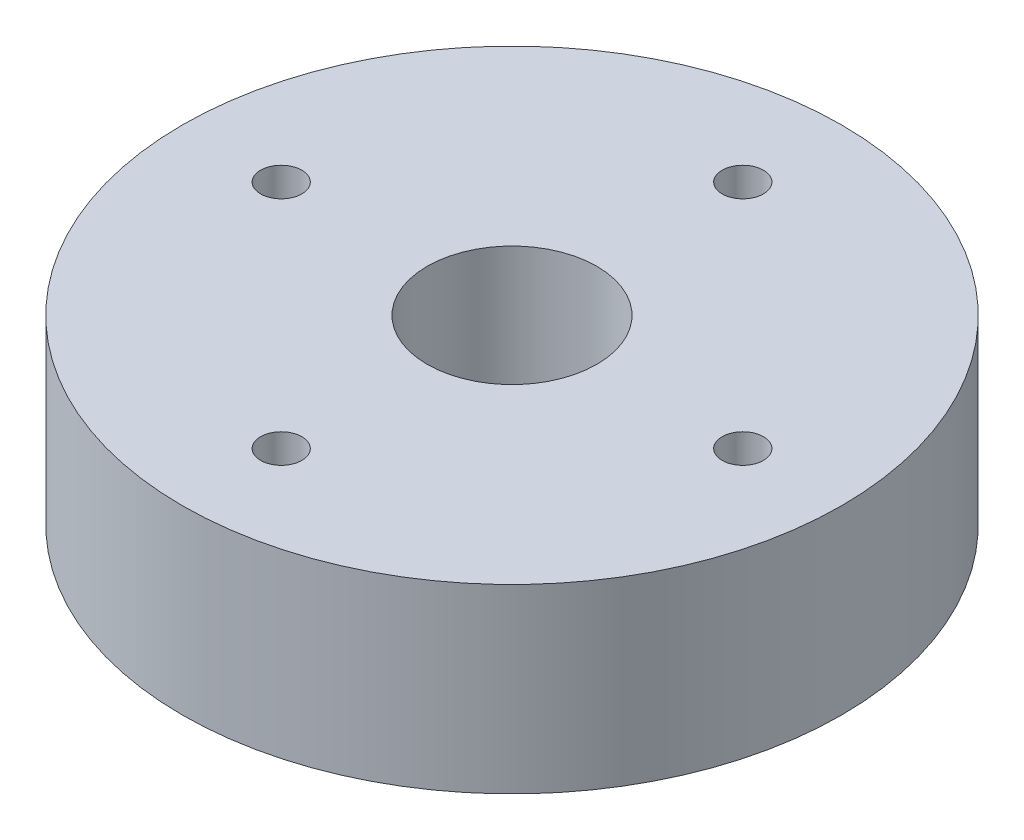
ISO-10303-21;
HEADER;
FILE_DESCRIPTION(('STEP AP214'),'2;1');
FILE_NAME('part.step','',(''),(''),'','','');
FILE_SCHEMA(('AUTOMOTIVE_DESIGN { 1 0 10303 214 1 1 1 1 }'));
ENDSEC;
DATA;
#1=APPLICATION_CONTEXT('core data for automotive mechanical design processes');
#2=APPLICATION_PROTOCOL_DEFINITION('international standard','automotive_design',2000,#1);
#3=PRODUCT_CONTEXT('',#1,'mechanical');
#4=PRODUCT('Part','Part','',(#3));
#5=PRODUCT_RELATED_PRODUCT_CATEGORY('part','',(#4));
#6=PRODUCT_DEFINITION_FORMATION('','',#4);
#7=PRODUCT_DEFINITION_CONTEXT('part definition',#1,'design');
#8=PRODUCT_DEFINITION('design','',#6,#7);
#9=PRODUCT_DEFINITION_SHAPE('','',#8);
#10=(LENGTH_UNIT() NAMED_UNIT(*) SI_UNIT(.MILLI.,.METRE.));
#11=(NAMED_UNIT(*) PLANE_ANGLE_UNIT() SI_UNIT($,.RADIAN.));
#12=(NAMED_UNIT(*) SI_UNIT($,.STERADIAN.) SOLID_ANGLE_UNIT());
#13=UNCERTAINTY_MEASURE_WITH_UNIT(LENGTH_MEASURE(1.E-05),#10,'distance_accuracy_value','');
#14=(GEOMETRIC_REPRESENTATION_CONTEXT(3) GLOBAL_UNCERTAINTY_ASSIGNED_CONTEXT((#13)) GLOBAL_UNIT_ASSIGNED_CONTEXT((#10,
#11,#12)) REPRESENTATION_CONTEXT('',''));
#15=CARTESIAN_POINT('',(0.,0.,0.));
#16=DIRECTION('',(0.,0.,1.));
#17=DIRECTION('',(1.,0.,0.));
#18=AXIS2_PLACEMENT_3D('',#15,#16,#17);
#19=CARTESIAN_POINT('',(0.,6.,0.));
#20=DIRECTION('',(0.,1.,0.));
#21=DIRECTION('',(0.,0.,1.));
#22=AXIS2_PLACEMENT_3D('',#19,#20,#21);
#23=PLANE('',#22);
#24=CARTESIAN_POINT('',(0.,6.,-14.));
#25=DIRECTION('',(0.,1.,0.));
#26=DIRECTION('',(0.,0.,1.));
#27=AXIS2_PLACEMENT_3D('',#24,#25,#26);
#28=CIRCLE('',#27,1.25);
#29=CARTESIAN_POINT('',(0.,6.,-12.75));
#30=VERTEX_POINT('',#29);
#31=EDGE_CURVE('E79',#30,#30,#28,.T.);
#32=ORIENTED_EDGE('',*,*,#31,.F.);
#33=EDGE_LOOP('',(#32));
#34=FACE_BOUND('',#33,.T.);
#35=CARTESIAN_POINT('',(0.,6.,14.));
#36=DIRECTION('',(0.,1.,0.));
#37=DIRECTION('',(0.,0.,1.));
#38=AXIS2_PLACEMENT_3D('',#35,#36,#37);
#39=CIRCLE('',#38,1.25);
#40=CARTESIAN_POINT('',(0.,6.,15.25));
#41=VERTEX_POINT('',#40);
#42=EDGE_CURVE('E78',#41,#41,#39,.T.);
#43=ORIENTED_EDGE('',*,*,#42,.F.);
#44=EDGE_LOOP('',(#43));
#45=FACE_BOUND('',#44,.T.);
#46=CARTESIAN_POINT('',(14.,6.,0.));
#47=DIRECTION('',(0.,1.,0.));
#48=DIRECTION('',(0.,0.,1.));
#49=AXIS2_PLACEMENT_3D('',#46,#47,#48);
#50=CIRCLE('',#49,1.25);
#51=CARTESIAN_POINT('',(14.,6.,1.25));
#52=VERTEX_POINT('',#51);
#53=EDGE_CURVE('E89',#52,#52,#50,.T.);
#54=ORIENTED_EDGE('',*,*,#53,.F.);
#55=EDGE_LOOP('',(#54));
#56=FACE_BOUND('',#55,.T.);
#57=CARTESIAN_POINT('',(-14.,6.,0.));
#58=DIRECTION('',(0.,1.,0.));
#59=DIRECTION('',(0.,0.,1.));
#60=AXIS2_PLACEMENT_3D('',#57,#58,#59);
#61=CIRCLE('',#60,1.25);
#62=CARTESIAN_POINT('',(-14.,6.,1.25));
#63=VERTEX_POINT('',#62);
#64=EDGE_CURVE('E95',#63,#63,#61,.T.);
#65=ORIENTED_EDGE('',*,*,#64,.F.);
#66=EDGE_LOOP('',(#65));
#67=FACE_BOUND('',#66,.T.);
#68=CARTESIAN_POINT('',(0.,6.,0.));
#69=DIRECTION('',(0.,1.,0.));
#70=DIRECTION('',(0.,0.,1.));
#71=AXIS2_PLACEMENT_3D('',#68,#69,#70);
#72=CIRCLE('',#71,20.);
#73=CARTESIAN_POINT('',(0.,6.,20.));
#74=VERTEX_POINT('',#73);
#75=EDGE_CURVE('E55',#74,#74,#72,.T.);
#76=ORIENTED_EDGE('',*,*,#75,.T.);
#77=EDGE_LOOP('',(#76));
#78=FACE_BOUND('',#77,.T.);
#79=CARTESIAN_POINT('',(0.,6.,0.));
#80=DIRECTION('',(0.,1.,0.));
#81=DIRECTION('',(0.,0.,1.));
#82=AXIS2_PLACEMENT_3D('',#79,#80,#81);
#83=CIRCLE('',#82,5.15);
#84=CARTESIAN_POINT('',(0.,6.,5.15));
#85=VERTEX_POINT('',#84);
#86=EDGE_CURVE('E114',#85,#85,#83,.T.);
#87=ORIENTED_EDGE('',*,*,#86,.F.);
#88=EDGE_LOOP('',(#87));
#89=FACE_BOUND('',#88,.T.);
#90=ADVANCED_FACE('F47',(#34,#45,#56,#67,#78,#89),#23,.T.);
#91=CARTESIAN_POINT('',(0.,0.,0.));
#92=DIRECTION('',(0.,1.,0.));
#93=DIRECTION('',(0.,0.,1.));
#94=AXIS2_PLACEMENT_3D('',#91,#92,#93);
#95=PLANE('',#94);
#96=CARTESIAN_POINT('',(0.,0.,0.));
#97=DIRECTION('',(0.,-1.,0.));
#98=DIRECTION('',(0.,0.,-1.));
#99=AXIS2_PLACEMENT_3D('',#96,#97,#98);
#100=CIRCLE('',#99,19.);
#101=CARTESIAN_POINT('',(0.,0.,-19.));
#102=VERTEX_POINT('',#101);
#103=EDGE_CURVE('E107',#102,#102,#100,.T.);
#104=ORIENTED_EDGE('',*,*,#103,.T.);
#105=EDGE_LOOP('',(#104));
#106=FACE_BOUND('',#105,.T.);
#107=CARTESIAN_POINT('',(0.,0.,0.));
#108=DIRECTION('',(0.,1.,0.));
#109=DIRECTION('',(0.,0.,1.));
#110=AXIS2_PLACEMENT_3D('',#107,#108,#109);
#111=CIRCLE('',#110,6.5);
#112=CARTESIAN_POINT('',(0.,0.,6.5));
#113=VERTEX_POINT('',#112);
#114=EDGE_CURVE('E12',#113,#113,#111,.F.);
#115=ORIENTED_EDGE('',*,*,#114,.F.);
#116=EDGE_LOOP('',(#115));
#117=FACE_BOUND('',#116,.T.);
#118=ADVANCED_FACE('F126',(#106,#117),#95,.F.);
#119=CARTESIAN_POINT('',(0.,6.,0.));
#120=DIRECTION('',(0.,-1.,0.));
#121=DIRECTION('',(0.,0.,-1.));
#122=AXIS2_PLACEMENT_3D('',#119,#120,#121);
#123=CYLINDRICAL_SURFACE('',#122,20.);
#124=ORIENTED_EDGE('',*,*,#75,.F.);
#125=EDGE_LOOP('',(#124));
#126=FACE_BOUND('',#125,.T.);
#127=CARTESIAN_POINT('',(0.,-5.,0.));
#128=DIRECTION('',(0.,-1.,0.));
#129=DIRECTION('',(0.,0.,-1.));
#130=AXIS2_PLACEMENT_3D('',#127,#128,#129);
#131=CIRCLE('',#130,20.);
#132=CARTESIAN_POINT('',(0.,-5.,-20.));
#133=VERTEX_POINT('',#132);
#134=EDGE_CURVE('E111',#133,#133,#131,.T.);
#135=ORIENTED_EDGE('',*,*,#134,.F.);
#136=EDGE_LOOP('',(#135));
#137=FACE_BOUND('',#136,.T.);
#138=ADVANCED_FACE('F49',(#126,#137),#123,.T.);
#139=CARTESIAN_POINT('',(0.,6.,0.));
#140=DIRECTION('',(0.,-1.,0.));
#141=DIRECTION('',(0.,0.,-1.));
#142=AXIS2_PLACEMENT_3D('',#139,#140,#141);
#143=CYLINDRICAL_SURFACE('',#142,5.15);
#144=ORIENTED_EDGE('',*,*,#86,.T.);
#145=EDGE_LOOP('',(#144));
#146=FACE_BOUND('',#145,.T.);
#147=CARTESIAN_POINT('',(0.,-12.,0.));
#148=DIRECTION('',(0.,-1.,0.));
#149=DIRECTION('',(0.,0.,-1.));
#150=AXIS2_PLACEMENT_3D('',#147,#148,#149);
#151=CIRCLE('',#150,5.15);
#152=CARTESIAN_POINT('',(0.,-12.,-5.15));
#153=VERTEX_POINT('',#152);
#154=EDGE_CURVE('E101',#153,#153,#151,.T.);
#155=ORIENTED_EDGE('',*,*,#154,.T.);
#156=EDGE_LOOP('',(#155));
#157=FACE_BOUND('',#156,.T.);
#158=ADVANCED_FACE('F125',(#146,#157),#143,.F.);
#159=CARTESIAN_POINT('',(0.,-5.,0.));
#160=DIRECTION('',(0.,1.,0.));
#161=DIRECTION('',(0.,0.,1.));
#162=AXIS2_PLACEMENT_3D('',#159,#160,#161);
#163=CYLINDRICAL_SURFACE('',#162,6.5);
#164=ORIENTED_EDGE('',*,*,#114,.T.);
#165=EDGE_LOOP('',(#164));
#166=FACE_BOUND('',#165,.T.);
#167=CARTESIAN_POINT('',(0.,-12.,0.));
#168=DIRECTION('',(0.,-1.,0.));
#169=DIRECTION('',(0.,0.,-1.));
#170=AXIS2_PLACEMENT_3D('',#167,#168,#169);
#171=CIRCLE('',#170,6.5);
#172=CARTESIAN_POINT('',(0.,-12.,-6.5));
#173=VERTEX_POINT('',#172);
#174=EDGE_CURVE('E104',#173,#173,#171,.T.);
#175=ORIENTED_EDGE('',*,*,#174,.F.);
#176=EDGE_LOOP('',(#175));
#177=FACE_BOUND('',#176,.T.);
#178=ADVANCED_FACE('F142',(#166,#177),#163,.T.);
#179=CARTESIAN_POINT('',(0.,-5.,0.));
#180=DIRECTION('',(0.,1.,0.));
#181=DIRECTION('',(0.,0.,1.));
#182=AXIS2_PLACEMENT_3D('',#179,#180,#181);
#183=CYLINDRICAL_SURFACE('',#182,19.);
#184=CARTESIAN_POINT('',(0.,-5.,0.));
#185=DIRECTION('',(0.,-1.,0.));
#186=DIRECTION('',(0.,0.,-1.));
#187=AXIS2_PLACEMENT_3D('',#184,#185,#186);
#188=CIRCLE('',#187,19.);
#189=CARTESIAN_POINT('',(0.,-5.,-19.));
#190=VERTEX_POINT('',#189);
#191=EDGE_CURVE('E108',#190,#190,#188,.T.);
#192=ORIENTED_EDGE('',*,*,#191,.T.);
#193=EDGE_LOOP('',(#192));
#194=FACE_BOUND('',#193,.T.);
#195=ORIENTED_EDGE('',*,*,#103,.F.);
#196=EDGE_LOOP('',(#195));
#197=FACE_BOUND('',#196,.T.);
#198=ADVANCED_FACE('F132',(#194,#197),#183,.F.);
#199=CARTESIAN_POINT('',(0.,-5.,0.));
#200=DIRECTION('',(0.,-1.,0.));
#201=DIRECTION('',(0.,0.,-1.));
#202=AXIS2_PLACEMENT_3D('',#199,#200,#201);
#203=PLANE('',#202);
#204=ORIENTED_EDGE('',*,*,#191,.F.);
#205=EDGE_LOOP('',(#204));
#206=FACE_BOUND('',#205,.T.);
#207=ORIENTED_EDGE('',*,*,#134,.T.);
#208=EDGE_LOOP('',(#207));
#209=FACE_BOUND('',#208,.T.);
#210=ADVANCED_FACE('F129',(#206,#209),#203,.T.);
#211=CARTESIAN_POINT('',(0.,-12.,0.));
#212=DIRECTION('',(0.,-1.,0.));
#213=DIRECTION('',(0.,0.,-1.));
#214=AXIS2_PLACEMENT_3D('',#211,#212,#213);
#215=PLANE('',#214);
#216=ORIENTED_EDGE('',*,*,#174,.T.);
#217=EDGE_LOOP('',(#216));
#218=FACE_BOUND('',#217,.T.);
#219=ORIENTED_EDGE('',*,*,#154,.F.);
#220=EDGE_LOOP('',(#219));
#221=FACE_BOUND('',#220,.T.);
#222=ADVANCED_FACE('F131',(#218,#221),#215,.T.);
#223=CARTESIAN_POINT('',(-14.,1.,0.));
#224=DIRECTION('',(0.,1.,0.));
#225=DIRECTION('',(0.,0.,1.));
#226=AXIS2_PLACEMENT_3D('',#223,#224,#225);
#227=CONICAL_SURFACE('',#226,1.25,1.02974425867665);
#228=CARTESIAN_POINT('',(-14.,0.248924226215551,0.));
#229=VERTEX_POINT('',#228);
#230=VERTEX_LOOP('',#229);
#231=FACE_BOUND('',#230,.T.);
#232=CARTESIAN_POINT('',(-14.,1.,0.));
#233=DIRECTION('',(0.,1.,0.));
#234=DIRECTION('',(0.,0.,1.));
#235=AXIS2_PLACEMENT_3D('',#232,#233,#234);
#236=CIRCLE('',#235,1.25);
#237=CARTESIAN_POINT('',(-14.,1.,1.25));
#238=VERTEX_POINT('',#237);
#239=EDGE_CURVE('E98',#238,#238,#236,.T.);
#240=ORIENTED_EDGE('',*,*,#239,.T.);
#241=EDGE_LOOP('',(#240));
#242=FACE_BOUND('',#241,.T.);
#243=ADVANCED_FACE('F139',(#231,#242),#227,.F.);
#244=CARTESIAN_POINT('',(-14.,6.,0.));
#245=DIRECTION('',(0.,1.,0.));
#246=DIRECTION('',(0.,0.,1.));
#247=AXIS2_PLACEMENT_3D('',#244,#245,#246);
#248=CYLINDRICAL_SURFACE('',#247,1.25);
#249=ORIENTED_EDGE('',*,*,#239,.F.);
#250=EDGE_LOOP('',(#249));
#251=FACE_BOUND('',#250,.T.);
#252=ORIENTED_EDGE('',*,*,#64,.T.);
#253=EDGE_LOOP('',(#252));
#254=FACE_BOUND('',#253,.T.);
#255=ADVANCED_FACE('F213',(#251,#254),#248,.F.);
#256=CARTESIAN_POINT('',(14.,1.,0.));
#257=DIRECTION('',(0.,1.,0.));
#258=DIRECTION('',(0.,0.,1.));
#259=AXIS2_PLACEMENT_3D('',#256,#257,#258);
#260=CONICAL_SURFACE('',#259,1.25,1.02974425867665);
#261=CARTESIAN_POINT('',(14.,0.248924226215551,0.));
#262=VERTEX_POINT('',#261);
#263=VERTEX_LOOP('',#262);
#264=FACE_BOUND('',#263,.T.);
#265=CARTESIAN_POINT('',(14.,1.,0.));
#266=DIRECTION('',(0.,1.,0.));
#267=DIRECTION('',(0.,0.,1.));
#268=AXIS2_PLACEMENT_3D('',#265,#266,#267);
#269=CIRCLE('',#268,1.25);
#270=CARTESIAN_POINT('',(14.,1.,1.25));
#271=VERTEX_POINT('',#270);
#272=EDGE_CURVE('E92',#271,#271,#269,.T.);
#273=ORIENTED_EDGE('',*,*,#272,.T.);
#274=EDGE_LOOP('',(#273));
#275=FACE_BOUND('',#274,.T.);
#276=ADVANCED_FACE('F221',(#264,#275),#260,.F.);
#277=CARTESIAN_POINT('',(14.,6.,0.));
#278=DIRECTION('',(0.,1.,0.));
#279=DIRECTION('',(0.,0.,1.));
#280=AXIS2_PLACEMENT_3D('',#277,#278,#279);
#281=CYLINDRICAL_SURFACE('',#280,1.25);
#282=ORIENTED_EDGE('',*,*,#272,.F.);
#283=EDGE_LOOP('',(#282));
#284=FACE_BOUND('',#283,.T.);
#285=ORIENTED_EDGE('',*,*,#53,.T.);
#286=EDGE_LOOP('',(#285));
#287=FACE_BOUND('',#286,.T.);
#288=ADVANCED_FACE('F231',(#284,#287),#281,.F.);
#289=CARTESIAN_POINT('',(0.,1.,14.));
#290=DIRECTION('',(0.,1.,0.));
#291=DIRECTION('',(0.,0.,1.));
#292=AXIS2_PLACEMENT_3D('',#289,#290,#291);
#293=CONICAL_SURFACE('',#292,1.25,1.02974425867665);
#294=CARTESIAN_POINT('',(0.,0.248924226215551,14.));
#295=VERTEX_POINT('',#294);
#296=VERTEX_LOOP('',#295);
#297=FACE_BOUND('',#296,.T.);
#298=CARTESIAN_POINT('',(0.,1.,14.));
#299=DIRECTION('',(0.,1.,0.));
#300=DIRECTION('',(0.,0.,1.));
#301=AXIS2_PLACEMENT_3D('',#298,#299,#300);
#302=CIRCLE('',#301,1.25);
#303=CARTESIAN_POINT('',(0.,1.,15.25));
#304=VERTEX_POINT('',#303);
#305=EDGE_CURVE('E82',#304,#304,#302,.T.);
#306=ORIENTED_EDGE('',*,*,#305,.T.);
#307=EDGE_LOOP('',(#306));
#308=FACE_BOUND('',#307,.T.);
#309=ADVANCED_FACE('F239',(#297,#308),#293,.F.);
#310=CARTESIAN_POINT('',(0.,6.,14.));
#311=DIRECTION('',(0.,1.,0.));
#312=DIRECTION('',(0.,0.,1.));
#313=AXIS2_PLACEMENT_3D('',#310,#311,#312);
#314=CYLINDRICAL_SURFACE('',#313,1.25);
#315=ORIENTED_EDGE('',*,*,#305,.F.);
#316=EDGE_LOOP('',(#315));
#317=FACE_BOUND('',#316,.T.);
#318=ORIENTED_EDGE('',*,*,#42,.T.);
#319=EDGE_LOOP('',(#318));
#320=FACE_BOUND('',#319,.T.);
#321=ADVANCED_FACE('F72',(#317,#320),#314,.F.);
#322=CARTESIAN_POINT('',(0.,1.,-14.));
#323=DIRECTION('',(0.,1.,0.));
#324=DIRECTION('',(0.,0.,1.));
#325=AXIS2_PLACEMENT_3D('',#322,#323,#324);
#326=CONICAL_SURFACE('',#325,1.25,1.02974425867665);
#327=CARTESIAN_POINT('',(0.,0.248924226215551,-14.));
#328=VERTEX_POINT('',#327);
#329=VERTEX_LOOP('',#328);
#330=FACE_BOUND('',#329,.T.);
#331=CARTESIAN_POINT('',(0.,1.,-14.));
#332=DIRECTION('',(0.,1.,0.));
#333=DIRECTION('',(0.,0.,1.));
#334=AXIS2_PLACEMENT_3D('',#331,#332,#333);
#335=CIRCLE('',#334,1.25);
#336=CARTESIAN_POINT('',(0.,1.,-12.75));
#337=VERTEX_POINT('',#336);
#338=EDGE_CURVE('E76',#337,#337,#335,.T.);
#339=ORIENTED_EDGE('',*,*,#338,.T.);
#340=EDGE_LOOP('',(#339));
#341=FACE_BOUND('',#340,.T.);
#342=ADVANCED_FACE('F68',(#330,#341),#326,.F.);
#343=CARTESIAN_POINT('',(0.,6.,-14.));
#344=DIRECTION('',(0.,1.,0.));
#345=DIRECTION('',(0.,0.,1.));
#346=AXIS2_PLACEMENT_3D('',#343,#344,#345);
#347=CYLINDRICAL_SURFACE('',#346,1.25);
#348=ORIENTED_EDGE('',*,*,#338,.F.);
#349=EDGE_LOOP('',(#348));
#350=FACE_BOUND('',#349,.T.);
#351=ORIENTED_EDGE('',*,*,#31,.T.);
#352=EDGE_LOOP('',(#351));
#353=FACE_BOUND('',#352,.T.);
#354=ADVANCED_FACE('F71',(#350,#353),#347,.F.);
#355=CLOSED_SHELL('',(#90,#118,#138,#158,#178,#198,#210,#222,#243,#255,#276,#288,#309,#321,#342,#354));
#356=MANIFOLD_SOLID_BREP('B2',#355);
#357=ADVANCED_BREP_SHAPE_REPRESENTATION('',(#18,#356),#14);
#358=SHAPE_DEFINITION_REPRESENTATION(#9,#357);
ENDSEC;
END-ISO-10303-21;
